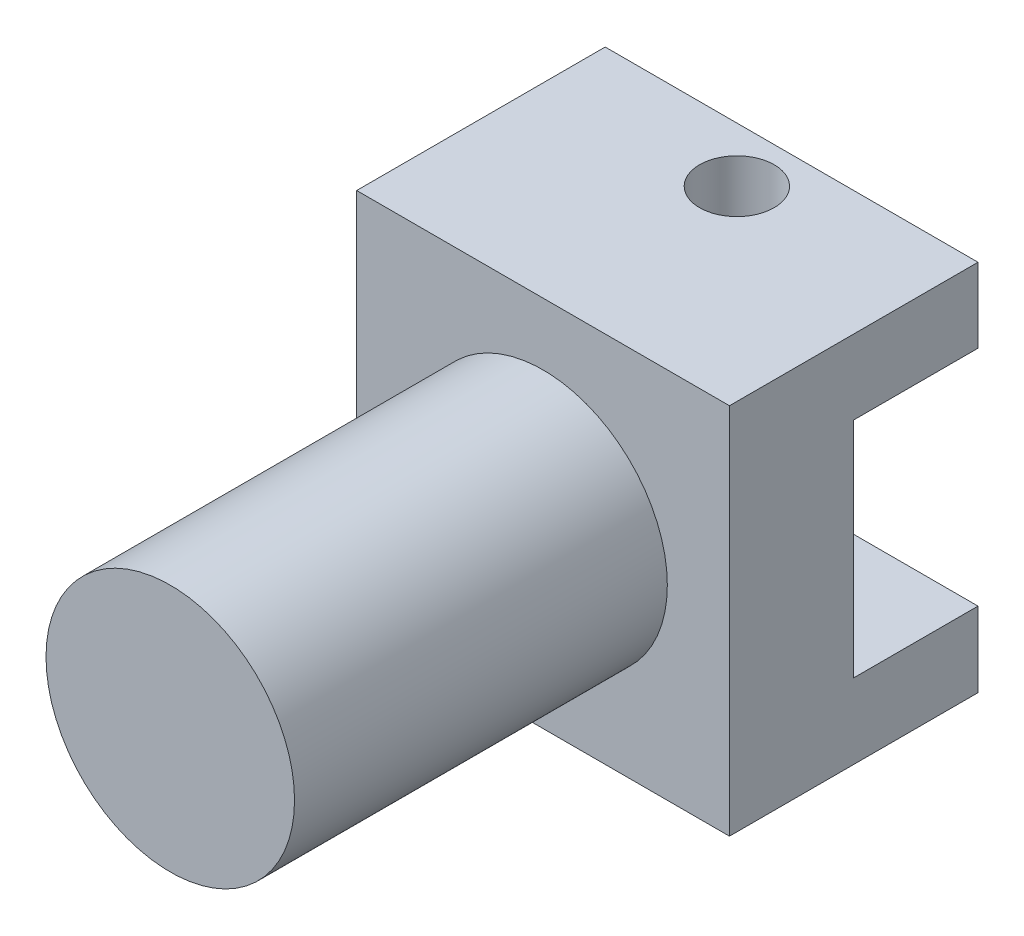
ISO-10303-21;
HEADER;
FILE_DESCRIPTION(('STEP AP214'),'2;1');
FILE_NAME('part.step','',(''),(''),'','','');
FILE_SCHEMA(('AUTOMOTIVE_DESIGN { 1 0 10303 214 1 1 1 1 }'));
ENDSEC;
DATA;
#1=APPLICATION_CONTEXT('core data for automotive mechanical design processes');
#2=APPLICATION_PROTOCOL_DEFINITION('international standard','automotive_design',2000,#1);
#3=PRODUCT_CONTEXT('',#1,'mechanical');
#4=PRODUCT('Part','Part','',(#3));
#5=PRODUCT_RELATED_PRODUCT_CATEGORY('part','',(#4));
#6=PRODUCT_DEFINITION_FORMATION('','',#4);
#7=PRODUCT_DEFINITION_CONTEXT('part definition',#1,'design');
#8=PRODUCT_DEFINITION('design','',#6,#7);
#9=PRODUCT_DEFINITION_SHAPE('','',#8);
#10=(LENGTH_UNIT() NAMED_UNIT(*) SI_UNIT(.MILLI.,.METRE.));
#11=(NAMED_UNIT(*) PLANE_ANGLE_UNIT() SI_UNIT($,.RADIAN.));
#12=(NAMED_UNIT(*) SI_UNIT($,.STERADIAN.) SOLID_ANGLE_UNIT());
#13=UNCERTAINTY_MEASURE_WITH_UNIT(LENGTH_MEASURE(1.E-05),#10,'distance_accuracy_value','');
#14=(GEOMETRIC_REPRESENTATION_CONTEXT(3) GLOBAL_UNCERTAINTY_ASSIGNED_CONTEXT((#13)) GLOBAL_UNIT_ASSIGNED_CONTEXT((#10,
#11,#12)) REPRESENTATION_CONTEXT('',''));
#15=CARTESIAN_POINT('',(0.,0.,0.));
#16=DIRECTION('',(0.,0.,1.));
#17=DIRECTION('',(1.,0.,0.));
#18=AXIS2_PLACEMENT_3D('',#15,#16,#17);
#19=CARTESIAN_POINT('',(0.,0.,25.4));
#20=DIRECTION('',(1.,0.,0.));
#21=DIRECTION('',(0.,0.,-1.));
#22=AXIS2_PLACEMENT_3D('',#19,#20,#21);
#23=PLANE('',#22);
#24=DIRECTION('',(0.,0.,-1.));
#25=VECTOR('',#24,1.);
#26=CARTESIAN_POINT('',(0.,76.2,25.4));
#27=LINE('',#26,#25);
#28=CARTESIAN_POINT('',(0.,76.2,25.4));
#29=VERTEX_POINT('',#28);
#30=CARTESIAN_POINT('',(0.,76.2,-25.4));
#31=VERTEX_POINT('',#30);
#32=EDGE_CURVE('E172',#29,#31,#27,.T.);
#33=ORIENTED_EDGE('',*,*,#32,.T.);
#34=DIRECTION('',(0.,1.,0.));
#35=VECTOR('',#34,1.);
#36=CARTESIAN_POINT('',(0.,0.,-25.4));
#37=LINE('',#36,#35);
#38=CARTESIAN_POINT('',(0.,60.9780288814558,-25.4));
#39=VERTEX_POINT('',#38);
#40=EDGE_CURVE('E147',#39,#31,#37,.T.);
#41=ORIENTED_EDGE('',*,*,#40,.F.);
#42=DIRECTION('',(0.,0.,1.));
#43=VECTOR('',#42,1.);
#44=CARTESIAN_POINT('',(0.,60.9780288814558,-25.4));
#45=LINE('',#44,#43);
#46=CARTESIAN_POINT('',(0.,60.9780288814558,0.));
#47=VERTEX_POINT('',#46);
#48=EDGE_CURVE('E153',#39,#47,#45,.T.);
#49=ORIENTED_EDGE('',*,*,#48,.T.);
#50=DIRECTION('',(0.,-1.,0.));
#51=VECTOR('',#50,1.);
#52=CARTESIAN_POINT('',(0.,0.,0.));
#53=LINE('',#52,#51);
#54=CARTESIAN_POINT('',(0.,15.3324929971992,0.));
#55=VERTEX_POINT('',#54);
#56=EDGE_CURVE('E163',#47,#55,#53,.T.);
#57=ORIENTED_EDGE('',*,*,#56,.T.);
#58=DIRECTION('',(0.,0.,1.));
#59=VECTOR('',#58,1.);
#60=CARTESIAN_POINT('',(0.,15.3324929971992,-25.4));
#61=LINE('',#60,#59);
#62=CARTESIAN_POINT('',(0.,15.3324929971992,-25.4));
#63=VERTEX_POINT('',#62);
#64=EDGE_CURVE('E116',#63,#55,#61,.T.);
#65=ORIENTED_EDGE('',*,*,#64,.F.);
#66=DIRECTION('',(0.,1.,0.));
#67=VECTOR('',#66,1.);
#68=CARTESIAN_POINT('',(0.,0.,-25.4));
#69=LINE('',#68,#67);
#70=CARTESIAN_POINT('',(0.,0.,-25.4));
#71=VERTEX_POINT('',#70);
#72=EDGE_CURVE('E131',#71,#63,#69,.T.);
#73=ORIENTED_EDGE('',*,*,#72,.F.);
#74=DIRECTION('',(0.,0.,-1.));
#75=VECTOR('',#74,1.);
#76=CARTESIAN_POINT('',(0.,0.,25.4));
#77=LINE('',#76,#75);
#78=CARTESIAN_POINT('',(0.,0.,25.4));
#79=VERTEX_POINT('',#78);
#80=EDGE_CURVE('E48',#79,#71,#77,.T.);
#81=ORIENTED_EDGE('',*,*,#80,.F.);
#82=DIRECTION('',(0.,-1.,0.));
#83=VECTOR('',#82,1.);
#84=CARTESIAN_POINT('',(0.,0.,25.4));
#85=LINE('',#84,#83);
#86=EDGE_CURVE('E165',#29,#79,#85,.T.);
#87=ORIENTED_EDGE('',*,*,#86,.F.);
#88=EDGE_LOOP('',(#33,#41,#49,#57,#65,#73,#81,#87));
#89=FACE_BOUND('',#88,.T.);
#90=ADVANCED_FACE('F40',(#89),#23,.F.);
#91=CARTESIAN_POINT('',(0.,0.,25.4));
#92=DIRECTION('',(0.,1.,0.));
#93=DIRECTION('',(0.,0.,1.));
#94=AXIS2_PLACEMENT_3D('',#91,#92,#93);
#95=PLANE('',#94);
#96=CARTESIAN_POINT('',(38.1,0.,-14.213689229737));
#97=DIRECTION('',(0.,-1.,0.));
#98=DIRECTION('',(0.,0.,-1.));
#99=AXIS2_PLACEMENT_3D('',#96,#97,#98);
#100=CIRCLE('',#99,7.62);
#101=CARTESIAN_POINT('',(38.1,0.,-21.833689229737));
#102=VERTEX_POINT('',#101);
#103=EDGE_CURVE('E225',#102,#102,#100,.T.);
#104=ORIENTED_EDGE('',*,*,#103,.F.);
#105=EDGE_LOOP('',(#104));
#106=FACE_BOUND('',#105,.T.);
#107=ORIENTED_EDGE('',*,*,#80,.T.);
#108=DIRECTION('',(-1.,0.,0.));
#109=VECTOR('',#108,1.);
#110=CARTESIAN_POINT('',(0.,0.,-25.4));
#111=LINE('',#110,#109);
#112=CARTESIAN_POINT('',(76.2,0.,-25.4));
#113=VERTEX_POINT('',#112);
#114=EDGE_CURVE('E127',#113,#71,#111,.T.);
#115=ORIENTED_EDGE('',*,*,#114,.F.);
#116=DIRECTION('',(0.,0.,-1.));
#117=VECTOR('',#116,1.);
#118=CARTESIAN_POINT('',(76.2,0.,25.4));
#119=LINE('',#118,#117);
#120=CARTESIAN_POINT('',(76.2,0.,25.4));
#121=VERTEX_POINT('',#120);
#122=EDGE_CURVE('E123',#121,#113,#119,.T.);
#123=ORIENTED_EDGE('',*,*,#122,.F.);
#124=DIRECTION('',(1.,0.,0.));
#125=VECTOR('',#124,1.);
#126=CARTESIAN_POINT('',(0.,0.,25.4));
#127=LINE('',#126,#125);
#128=EDGE_CURVE('E167',#79,#121,#127,.T.);
#129=ORIENTED_EDGE('',*,*,#128,.F.);
#130=EDGE_LOOP('',(#107,#115,#123,#129));
#131=FACE_BOUND('',#130,.T.);
#132=ADVANCED_FACE('F181',(#106,#131),#95,.F.);
#133=CARTESIAN_POINT('',(76.2,0.,25.4));
#134=DIRECTION('',(-1.,0.,0.));
#135=DIRECTION('',(0.,0.,1.));
#136=AXIS2_PLACEMENT_3D('',#133,#134,#135);
#137=PLANE('',#136);
#138=ORIENTED_EDGE('',*,*,#122,.T.);
#139=DIRECTION('',(0.,-1.,0.));
#140=VECTOR('',#139,1.);
#141=CARTESIAN_POINT('',(76.2,0.,-25.4));
#142=LINE('',#141,#140);
#143=CARTESIAN_POINT('',(76.2,15.3324929971992,-25.4));
#144=VERTEX_POINT('',#143);
#145=EDGE_CURVE('E119',#144,#113,#142,.T.);
#146=ORIENTED_EDGE('',*,*,#145,.F.);
#147=DIRECTION('',(0.,0.,1.));
#148=VECTOR('',#147,1.);
#149=CARTESIAN_POINT('',(76.2,15.3324929971992,-25.4));
#150=LINE('',#149,#148);
#151=CARTESIAN_POINT('',(76.2,15.3324929971992,0.));
#152=VERTEX_POINT('',#151);
#153=EDGE_CURVE('E108',#144,#152,#150,.T.);
#154=ORIENTED_EDGE('',*,*,#153,.T.);
#155=DIRECTION('',(0.,1.,0.));
#156=VECTOR('',#155,1.);
#157=CARTESIAN_POINT('',(76.2,0.,0.));
#158=LINE('',#157,#156);
#159=CARTESIAN_POINT('',(76.2,60.9780288814558,0.));
#160=VERTEX_POINT('',#159);
#161=EDGE_CURVE('E56',#152,#160,#158,.T.);
#162=ORIENTED_EDGE('',*,*,#161,.T.);
#163=DIRECTION('',(0.,0.,1.));
#164=VECTOR('',#163,1.);
#165=CARTESIAN_POINT('',(76.2,60.9780288814558,-25.4));
#166=LINE('',#165,#164);
#167=CARTESIAN_POINT('',(76.2,60.9780288814558,-25.4));
#168=VERTEX_POINT('',#167);
#169=EDGE_CURVE('E158',#168,#160,#166,.T.);
#170=ORIENTED_EDGE('',*,*,#169,.F.);
#171=DIRECTION('',(0.,-1.,0.));
#172=VECTOR('',#171,1.);
#173=CARTESIAN_POINT('',(76.2,0.,-25.4));
#174=LINE('',#173,#172);
#175=CARTESIAN_POINT('',(76.2,76.2,-25.4));
#176=VERTEX_POINT('',#175);
#177=EDGE_CURVE('E142',#176,#168,#174,.T.);
#178=ORIENTED_EDGE('',*,*,#177,.F.);
#179=DIRECTION('',(0.,0.,-1.));
#180=VECTOR('',#179,1.);
#181=CARTESIAN_POINT('',(76.2,76.2,25.4));
#182=LINE('',#181,#180);
#183=CARTESIAN_POINT('',(76.2,76.2,25.4));
#184=VERTEX_POINT('',#183);
#185=EDGE_CURVE('E177',#184,#176,#182,.T.);
#186=ORIENTED_EDGE('',*,*,#185,.F.);
#187=DIRECTION('',(0.,1.,0.));
#188=VECTOR('',#187,1.);
#189=CARTESIAN_POINT('',(76.2,0.,25.4));
#190=LINE('',#189,#188);
#191=EDGE_CURVE('E169',#121,#184,#190,.T.);
#192=ORIENTED_EDGE('',*,*,#191,.F.);
#193=EDGE_LOOP('',(#138,#146,#154,#162,#170,#178,#186,#192));
#194=FACE_BOUND('',#193,.T.);
#195=ADVANCED_FACE('F120',(#194),#137,.F.);
#196=CARTESIAN_POINT('',(0.,76.2,25.4));
#197=DIRECTION('',(0.,-1.,0.));
#198=DIRECTION('',(0.,0.,-1.));
#199=AXIS2_PLACEMENT_3D('',#196,#197,#198);
#200=PLANE('',#199);
#201=CARTESIAN_POINT('',(38.1,76.2,-14.213689229737));
#202=DIRECTION('',(0.,-1.,0.));
#203=DIRECTION('',(0.,0.,-1.));
#204=AXIS2_PLACEMENT_3D('',#201,#202,#203);
#205=CIRCLE('',#204,7.62);
#206=CARTESIAN_POINT('',(38.1,76.2,-21.833689229737));
#207=VERTEX_POINT('',#206);
#208=EDGE_CURVE('E227',#207,#207,#205,.T.);
#209=ORIENTED_EDGE('',*,*,#208,.T.);
#210=EDGE_LOOP('',(#209));
#211=FACE_BOUND('',#210,.T.);
#212=ORIENTED_EDGE('',*,*,#185,.T.);
#213=DIRECTION('',(1.,0.,0.));
#214=VECTOR('',#213,1.);
#215=CARTESIAN_POINT('',(0.,76.2,-25.4));
#216=LINE('',#215,#214);
#217=EDGE_CURVE('E150',#31,#176,#216,.T.);
#218=ORIENTED_EDGE('',*,*,#217,.F.);
#219=ORIENTED_EDGE('',*,*,#32,.F.);
#220=DIRECTION('',(-1.,0.,0.));
#221=VECTOR('',#220,1.);
#222=CARTESIAN_POINT('',(0.,76.2,25.4));
#223=LINE('',#222,#221);
#224=EDGE_CURVE('E64',#184,#29,#223,.T.);
#225=ORIENTED_EDGE('',*,*,#224,.F.);
#226=EDGE_LOOP('',(#212,#218,#219,#225));
#227=FACE_BOUND('',#226,.T.);
#228=ADVANCED_FACE('F196',(#211,#227),#200,.F.);
#229=CARTESIAN_POINT('',(0.,0.,25.4));
#230=DIRECTION('',(0.,0.,-1.));
#231=DIRECTION('',(-1.,0.,0.));
#232=AXIS2_PLACEMENT_3D('',#229,#230,#231);
#233=PLANE('',#232);
#234=CARTESIAN_POINT('',(38.1,38.1,25.4));
#235=DIRECTION('',(0.,0.,1.));
#236=DIRECTION('',(1.,0.,0.));
#237=AXIS2_PLACEMENT_3D('',#234,#235,#236);
#238=CIRCLE('',#237,25.4);
#239=CARTESIAN_POINT('',(12.7,38.1,25.4));
#240=VERTEX_POINT('',#239);
#241=EDGE_CURVE('E11',#240,#240,#238,.T.);
#242=ORIENTED_EDGE('',*,*,#241,.F.);
#243=EDGE_LOOP('',(#242));
#244=FACE_BOUND('',#243,.T.);
#245=ORIENTED_EDGE('',*,*,#86,.T.);
#246=ORIENTED_EDGE('',*,*,#128,.T.);
#247=ORIENTED_EDGE('',*,*,#191,.T.);
#248=ORIENTED_EDGE('',*,*,#224,.T.);
#249=EDGE_LOOP('',(#245,#246,#247,#248));
#250=FACE_BOUND('',#249,.T.);
#251=ADVANCED_FACE('F197',(#244,#250),#233,.F.);
#252=CARTESIAN_POINT('',(0.,0.,0.));
#253=DIRECTION('',(0.,0.,-1.));
#254=DIRECTION('',(-1.,0.,0.));
#255=AXIS2_PLACEMENT_3D('',#252,#253,#254);
#256=PLANE('',#255);
#257=DIRECTION('',(-1.,0.,0.));
#258=VECTOR('',#257,1.);
#259=CARTESIAN_POINT('',(0.,15.3324929971992,0.));
#260=LINE('',#259,#258);
#261=EDGE_CURVE('E114',#152,#55,#260,.T.);
#262=ORIENTED_EDGE('',*,*,#261,.T.);
#263=ORIENTED_EDGE('',*,*,#56,.F.);
#264=DIRECTION('',(-1.,0.,0.));
#265=VECTOR('',#264,1.);
#266=CARTESIAN_POINT('',(0.,60.9780288814558,0.));
#267=LINE('',#266,#265);
#268=EDGE_CURVE('E115',#160,#47,#267,.T.);
#269=ORIENTED_EDGE('',*,*,#268,.F.);
#270=ORIENTED_EDGE('',*,*,#161,.F.);
#271=EDGE_LOOP('',(#262,#263,#269,#270));
#272=FACE_BOUND('',#271,.T.);
#273=ADVANCED_FACE('F185',(#272),#256,.T.);
#274=CARTESIAN_POINT('',(38.1,38.1,101.6));
#275=DIRECTION('',(0.,0.,-1.));
#276=DIRECTION('',(-1.,0.,0.));
#277=AXIS2_PLACEMENT_3D('',#274,#275,#276);
#278=CYLINDRICAL_SURFACE('',#277,25.4);
#279=CARTESIAN_POINT('',(38.1,38.1,101.6));
#280=DIRECTION('',(0.,0.,1.));
#281=DIRECTION('',(1.,0.,0.));
#282=AXIS2_PLACEMENT_3D('',#279,#280,#281);
#283=CIRCLE('',#282,25.4);
#284=CARTESIAN_POINT('',(12.7,38.1,101.6));
#285=VERTEX_POINT('',#284);
#286=EDGE_CURVE('E161',#285,#285,#283,.T.);
#287=CARTESIAN_POINT('',(12.7,38.1,101.6));
#288=CARTESIAN_POINT('',(12.7,38.1,100.80625));
#289=CARTESIAN_POINT('',(12.7,38.1,100.0125));
#290=CARTESIAN_POINT('',(12.7,38.1,98.425));
#291=CARTESIAN_POINT('',(12.7,38.1,97.63125));
#292=CARTESIAN_POINT('',(12.7,38.1,96.04375));
#293=CARTESIAN_POINT('',(12.7,38.1,95.25));
#294=CARTESIAN_POINT('',(12.7,38.1,93.6625));
#295=CARTESIAN_POINT('',(12.7,38.1,92.86875));
#296=CARTESIAN_POINT('',(12.7,38.1,91.28125));
#297=CARTESIAN_POINT('',(12.7,38.1,90.4875));
#298=CARTESIAN_POINT('',(12.7,38.1,88.9));
#299=CARTESIAN_POINT('',(12.7,38.1,88.10625));
#300=CARTESIAN_POINT('',(12.7,38.1,86.51875));
#301=CARTESIAN_POINT('',(12.7,38.1,85.725));
#302=CARTESIAN_POINT('',(12.7,38.1,84.1375));
#303=CARTESIAN_POINT('',(12.7,38.1,83.34375));
#304=CARTESIAN_POINT('',(12.7,38.1,81.75625));
#305=CARTESIAN_POINT('',(12.7,38.1,80.9625));
#306=CARTESIAN_POINT('',(12.7,38.1,79.375));
#307=CARTESIAN_POINT('',(12.7,38.1,78.58125));
#308=CARTESIAN_POINT('',(12.7,38.1,76.99375));
#309=CARTESIAN_POINT('',(12.7,38.1,76.2));
#310=CARTESIAN_POINT('',(12.7,38.1,74.6125));
#311=CARTESIAN_POINT('',(12.7,38.1,73.81875));
#312=CARTESIAN_POINT('',(12.7,38.1,72.23125));
#313=CARTESIAN_POINT('',(12.7,38.1,71.4375));
#314=CARTESIAN_POINT('',(12.7,38.1,69.85));
#315=CARTESIAN_POINT('',(12.7,38.1,69.05625));
#316=CARTESIAN_POINT('',(12.7,38.1,67.46875));
#317=CARTESIAN_POINT('',(12.7,38.1,66.675));
#318=CARTESIAN_POINT('',(12.7,38.1,65.0875));
#319=CARTESIAN_POINT('',(12.7,38.1,64.29375));
#320=CARTESIAN_POINT('',(12.7,38.1,62.70625));
#321=CARTESIAN_POINT('',(12.7,38.1,61.9125));
#322=CARTESIAN_POINT('',(12.7,38.1,60.325));
#323=CARTESIAN_POINT('',(12.7,38.1,59.53125));
#324=CARTESIAN_POINT('',(12.7,38.1,57.94375));
#325=CARTESIAN_POINT('',(12.7,38.1,57.15));
#326=CARTESIAN_POINT('',(12.7,38.1,55.5625));
#327=CARTESIAN_POINT('',(12.7,38.1,54.76875));
#328=CARTESIAN_POINT('',(12.7,38.1,53.18125));
#329=CARTESIAN_POINT('',(12.7,38.1,52.3875));
#330=CARTESIAN_POINT('',(12.7,38.1,50.8));
#331=CARTESIAN_POINT('',(12.7,38.1,50.00625));
#332=CARTESIAN_POINT('',(12.7,38.1,48.41875));
#333=CARTESIAN_POINT('',(12.7,38.1,47.625));
#334=CARTESIAN_POINT('',(12.7,38.1,46.0375));
#335=CARTESIAN_POINT('',(12.7,38.1,45.24375));
#336=CARTESIAN_POINT('',(12.7,38.1,43.65625));
#337=CARTESIAN_POINT('',(12.7,38.1,42.8625));
#338=CARTESIAN_POINT('',(12.7,38.1,41.275));
#339=CARTESIAN_POINT('',(12.7,38.1,40.48125));
#340=CARTESIAN_POINT('',(12.7,38.1,38.89375));
#341=CARTESIAN_POINT('',(12.7,38.1,38.1));
#342=CARTESIAN_POINT('',(12.7,38.1,36.5125));
#343=CARTESIAN_POINT('',(12.7,38.1,35.71875));
#344=CARTESIAN_POINT('',(12.7,38.1,34.13125));
#345=CARTESIAN_POINT('',(12.7,38.1,33.3375));
#346=CARTESIAN_POINT('',(12.7,38.1,31.75));
#347=CARTESIAN_POINT('',(12.7,38.1,30.95625));
#348=CARTESIAN_POINT('',(12.7,38.1,29.36875));
#349=CARTESIAN_POINT('',(12.7,38.1,28.575));
#350=CARTESIAN_POINT('',(12.7,38.1,26.9875));
#351=CARTESIAN_POINT('',(12.7,38.1,26.19375));
#352=CARTESIAN_POINT('',(12.7,38.1,25.4));
#353=B_SPLINE_CURVE_WITH_KNOTS('',3,(#287,#288,#289,#290,#291,#292,#293,#294,#295,#296,#297,
#298,#299,#300,#301,#302,#303,#304,#305,#306,#307,#308,#309,#310,#311,#312,#313,#314,#315,#316,
#317,#318,#319,#320,#321,#322,#323,#324,#325,#326,#327,#328,#329,#330,#331,#332,#333,#334,#335,
#336,#337,#338,#339,#340,#341,#342,#343,#344,#345,#346,#347,#348,#349,#350,#351,#352),
.UNSPECIFIED.,.F.,.F.,(4,2,2,2,2,2,2,2,2,2,2,2,2,2,2,2,2,2,2,2,2,2,2,2,2,2,2,2,2,2,2,2,4),(0.,
2.38125,4.7625,7.14375,9.52500000000001,11.90625,14.2875,16.66875,19.05,21.43125,23.8125,
26.19375,28.575,30.95625,33.3375,35.71875,38.1,40.48125,42.8625,45.24375,47.625,50.00625,
52.3875,54.76875,57.15,59.53125,61.9125,64.29375,66.675,69.05625,71.4375,73.81875,76.2),.UNSPECIFIED.);
#354=EDGE_CURVE('BSEAM205',#285,#240,#353,.T.);
#355=ORIENTED_EDGE('',*,*,#286,.F.);
#356=ORIENTED_EDGE('',*,*,#241,.T.);
#357=ORIENTED_EDGE('',*,*,#354,.T.);
#358=ORIENTED_EDGE('',*,*,#354,.F.);
#359=EDGE_LOOP('',(#355,#357,#356,#358));
#360=FACE_BOUND('',#359,.T.);
#361=ADVANCED_FACE('F205',(#360),#278,.T.);
#362=CARTESIAN_POINT('',(0.,0.,101.6));
#363=DIRECTION('',(0.,0.,1.));
#364=DIRECTION('',(1.,0.,0.));
#365=AXIS2_PLACEMENT_3D('',#362,#363,#364);
#366=PLANE('',#365);
#367=ORIENTED_EDGE('',*,*,#286,.T.);
#368=EDGE_LOOP('',(#367));
#369=FACE_BOUND('',#368,.T.);
#370=ADVANCED_FACE('F256',(#369),#366,.T.);
#371=CARTESIAN_POINT('',(0.,60.9780288814558,-25.4));
#372=DIRECTION('',(0.,1.,0.));
#373=DIRECTION('',(0.,0.,1.));
#374=AXIS2_PLACEMENT_3D('',#371,#372,#373);
#375=PLANE('',#374);
#376=CARTESIAN_POINT('',(38.1,60.9780288814558,-14.213689229737));
#377=DIRECTION('',(0.,1.,0.));
#378=DIRECTION('',(0.,0.,1.));
#379=AXIS2_PLACEMENT_3D('',#376,#377,#378);
#380=CIRCLE('',#379,7.62);
#381=CARTESIAN_POINT('',(38.1,60.9780288814558,-21.833689229737));
#382=VERTEX_POINT('',#381);
#383=EDGE_CURVE('E134',#382,#382,#380,.T.);
#384=ORIENTED_EDGE('',*,*,#383,.T.);
#385=EDGE_LOOP('',(#384));
#386=FACE_BOUND('',#385,.T.);
#387=ORIENTED_EDGE('',*,*,#268,.T.);
#388=ORIENTED_EDGE('',*,*,#48,.F.);
#389=DIRECTION('',(-1.,0.,0.));
#390=VECTOR('',#389,1.);
#391=CARTESIAN_POINT('',(0.,60.9780288814558,-25.4));
#392=LINE('',#391,#390);
#393=EDGE_CURVE('E145',#168,#39,#392,.T.);
#394=ORIENTED_EDGE('',*,*,#393,.F.);
#395=ORIENTED_EDGE('',*,*,#169,.T.);
#396=EDGE_LOOP('',(#387,#388,#394,#395));
#397=FACE_BOUND('',#396,.T.);
#398=ADVANCED_FACE('F188',(#386,#397),#375,.F.);
#399=CARTESIAN_POINT('',(0.,0.,-25.4));
#400=DIRECTION('',(0.,0.,-1.));
#401=DIRECTION('',(-1.,0.,0.));
#402=AXIS2_PLACEMENT_3D('',#399,#400,#401);
#403=PLANE('',#402);
#404=ORIENTED_EDGE('',*,*,#177,.T.);
#405=ORIENTED_EDGE('',*,*,#393,.T.);
#406=ORIENTED_EDGE('',*,*,#40,.T.);
#407=ORIENTED_EDGE('',*,*,#217,.T.);
#408=EDGE_LOOP('',(#404,#405,#406,#407));
#409=FACE_BOUND('',#408,.T.);
#410=ADVANCED_FACE('F192',(#409),#403,.T.);
#411=CARTESIAN_POINT('',(0.,15.3324929971992,-25.4));
#412=DIRECTION('',(0.,1.,0.));
#413=DIRECTION('',(0.,0.,1.));
#414=AXIS2_PLACEMENT_3D('',#411,#412,#413);
#415=PLANE('',#414);
#416=CARTESIAN_POINT('',(38.1,15.3324929971992,-14.213689229737));
#417=DIRECTION('',(0.,1.,0.));
#418=DIRECTION('',(0.,0.,1.));
#419=AXIS2_PLACEMENT_3D('',#416,#417,#418);
#420=CIRCLE('',#419,7.62);
#421=CARTESIAN_POINT('',(38.1,15.3324929971992,-21.833689229737));
#422=VERTEX_POINT('',#421);
#423=EDGE_CURVE('E43',#422,#422,#420,.T.);
#424=ORIENTED_EDGE('',*,*,#423,.F.);
#425=EDGE_LOOP('',(#424));
#426=FACE_BOUND('',#425,.T.);
#427=ORIENTED_EDGE('',*,*,#261,.F.);
#428=ORIENTED_EDGE('',*,*,#153,.F.);
#429=DIRECTION('',(-1.,0.,0.));
#430=VECTOR('',#429,1.);
#431=CARTESIAN_POINT('',(0.,15.3324929971992,-25.4));
#432=LINE('',#431,#430);
#433=EDGE_CURVE('E112',#144,#63,#432,.T.);
#434=ORIENTED_EDGE('',*,*,#433,.T.);
#435=ORIENTED_EDGE('',*,*,#64,.T.);
#436=EDGE_LOOP('',(#427,#428,#434,#435));
#437=FACE_BOUND('',#436,.T.);
#438=ADVANCED_FACE('F110',(#426,#437),#415,.T.);
#439=CARTESIAN_POINT('',(0.,0.,-25.4));
#440=DIRECTION('',(0.,0.,-1.));
#441=DIRECTION('',(-1.,0.,0.));
#442=AXIS2_PLACEMENT_3D('',#439,#440,#441);
#443=PLANE('',#442);
#444=ORIENTED_EDGE('',*,*,#433,.F.);
#445=ORIENTED_EDGE('',*,*,#145,.T.);
#446=ORIENTED_EDGE('',*,*,#114,.T.);
#447=ORIENTED_EDGE('',*,*,#72,.T.);
#448=EDGE_LOOP('',(#444,#445,#446,#447));
#449=FACE_BOUND('',#448,.T.);
#450=ADVANCED_FACE('F129',(#449),#443,.T.);
#451=CARTESIAN_POINT('',(38.1,76.2,-14.213689229737));
#452=DIRECTION('',(0.,-1.,0.));
#453=DIRECTION('',(0.,0.,-1.));
#454=AXIS2_PLACEMENT_3D('',#451,#452,#453);
#455=CYLINDRICAL_SURFACE('',#454,7.62);
#456=CARTESIAN_POINT('',(38.1,15.3324929971992,-21.833689229737));
#457=CARTESIAN_POINT('',(38.1,15.1727795284784,-21.833689229737));
#458=CARTESIAN_POINT('',(38.1,15.0130660597575,-21.833689229737));
#459=CARTESIAN_POINT('',(38.1,14.6936391223159,-21.833689229737));
#460=CARTESIAN_POINT('',(38.1,14.5339256535951,-21.833689229737));
#461=CARTESIAN_POINT('',(38.1,14.2144987161534,-21.833689229737));
#462=CARTESIAN_POINT('',(38.1,14.0547852474326,-21.833689229737));
#463=CARTESIAN_POINT('',(38.1,13.7353583099909,-21.833689229737));
#464=CARTESIAN_POINT('',(38.1,13.5756448412701,-21.833689229737));
#465=CARTESIAN_POINT('',(38.1,13.2562179038285,-21.833689229737));
#466=CARTESIAN_POINT('',(38.1,13.0965044351076,-21.833689229737));
#467=CARTESIAN_POINT('',(38.1,12.777077497666,-21.833689229737));
#468=CARTESIAN_POINT('',(38.1,12.6173640289452,-21.833689229737));
#469=CARTESIAN_POINT('',(38.1,12.2979370915035,-21.833689229737));
#470=CARTESIAN_POINT('',(38.1,12.1382236227827,-21.833689229737));
#471=CARTESIAN_POINT('',(38.1,11.818796685341,-21.833689229737));
#472=CARTESIAN_POINT('',(38.1,11.6590832166202,-21.833689229737));
#473=CARTESIAN_POINT('',(38.1,11.3396562791786,-21.833689229737));
#474=CARTESIAN_POINT('',(38.1,11.1799428104577,-21.833689229737));
#475=CARTESIAN_POINT('',(38.1,10.8605158730161,-21.833689229737));
#476=CARTESIAN_POINT('',(38.1,10.7008024042953,-21.833689229737));
#477=CARTESIAN_POINT('',(38.1,10.3813754668536,-21.833689229737));
#478=CARTESIAN_POINT('',(38.1,10.2216619981328,-21.833689229737));
#479=CARTESIAN_POINT('',(38.1,9.90223506069115,-21.833689229737));
#480=CARTESIAN_POINT('',(38.1,9.74252159197032,-21.833689229737));
#481=CARTESIAN_POINT('',(38.1,9.42309465452866,-21.833689229737));
#482=CARTESIAN_POINT('',(38.1,9.26338118580784,-21.833689229737));
#483=CARTESIAN_POINT('',(38.1,8.94395424836619,-21.833689229737));
#484=CARTESIAN_POINT('',(38.1,8.78424077964537,-21.833689229737));
#485=CARTESIAN_POINT('',(38.1,8.46481384220372,-21.833689229737));
#486=CARTESIAN_POINT('',(38.1,8.3051003734829,-21.833689229737));
#487=CARTESIAN_POINT('',(38.1,7.98567343604125,-21.833689229737));
#488=CARTESIAN_POINT('',(38.1,7.82595996732042,-21.833689229737));
#489=CARTESIAN_POINT('',(38.1,7.50653302987877,-21.833689229737));
#490=CARTESIAN_POINT('',(38.1,7.34681956115794,-21.833689229737));
#491=CARTESIAN_POINT('',(38.1,7.02739262371629,-21.833689229737));
#492=CARTESIAN_POINT('',(38.1,6.86767915499547,-21.833689229737));
#493=CARTESIAN_POINT('',(38.1,6.54825221755382,-21.833689229737));
#494=CARTESIAN_POINT('',(38.1,6.388538748833,-21.833689229737));
#495=CARTESIAN_POINT('',(38.1,6.06911181139135,-21.833689229737));
#496=CARTESIAN_POINT('',(38.1,5.90939834267052,-21.833689229737));
#497=CARTESIAN_POINT('',(38.1,5.58997140522887,-21.833689229737));
#498=CARTESIAN_POINT('',(38.1,5.43025793650804,-21.833689229737));
#499=CARTESIAN_POINT('',(38.1,5.11083099906639,-21.833689229737));
#500=CARTESIAN_POINT('',(38.1,4.95111753034557,-21.833689229737));
#501=CARTESIAN_POINT('',(38.1,4.63169059290392,-21.833689229737));
#502=CARTESIAN_POINT('',(38.1,4.4719771241831,-21.833689229737));
#503=CARTESIAN_POINT('',(38.1,4.15255018674145,-21.833689229737));
#504=CARTESIAN_POINT('',(38.1,3.99283671802062,-21.833689229737));
#505=CARTESIAN_POINT('',(38.1,3.67340978057897,-21.833689229737));
#506=CARTESIAN_POINT('',(38.1,3.51369631185814,-21.833689229737));
#507=CARTESIAN_POINT('',(38.1,3.19426937441649,-21.833689229737));
#508=CARTESIAN_POINT('',(38.1,3.03455590569567,-21.833689229737));
#509=CARTESIAN_POINT('',(38.1,2.71512896825402,-21.833689229737));
#510=CARTESIAN_POINT('',(38.1,2.5554154995332,-21.833689229737));
#511=CARTESIAN_POINT('',(38.1,2.23598856209155,-21.833689229737));
#512=CARTESIAN_POINT('',(38.1,2.07627509337073,-21.833689229737));
#513=CARTESIAN_POINT('',(38.1,1.75684815592907,-21.833689229737));
#514=CARTESIAN_POINT('',(38.1,1.59713468720824,-21.833689229737));
#515=CARTESIAN_POINT('',(38.1,1.27770774976659,-21.833689229737));
#516=CARTESIAN_POINT('',(38.1,1.11799428104577,-21.833689229737));
#517=CARTESIAN_POINT('',(38.1,0.798567343604127,-21.833689229737));
#518=CARTESIAN_POINT('',(38.1,0.638853874883304,-21.833689229737));
#519=CARTESIAN_POINT('',(38.1,0.319426937441654,-21.833689229737));
#520=CARTESIAN_POINT('',(38.1,0.159713468720827,-21.833689229737));
#521=CARTESIAN_POINT('',(38.1,0.,-21.833689229737));
#522=B_SPLINE_CURVE_WITH_KNOTS('',3,(#456,#457,#458,#459,#460,#461,#462,#463,#464,#465,#466,
#467,#468,#469,#470,#471,#472,#473,#474,#475,#476,#477,#478,#479,#480,#481,#482,#483,#484,#485,
#486,#487,#488,#489,#490,#491,#492,#493,#494,#495,#496,#497,#498,#499,#500,#501,#502,#503,#504,
#505,#506,#507,#508,#509,#510,#511,#512,#513,#514,#515,#516,#517,#518,#519,#520,#521),
.UNSPECIFIED.,.F.,.F.,(4,2,2,2,2,2,2,2,2,2,2,2,2,2,2,2,2,2,2,2,2,2,2,2,2,2,2,2,2,2,2,2,4),(0.,
0.479140406162475,0.958280812324949,1.43742121848742,1.91656162464989,2.39570203081237,
2.87484243697484,3.35398284313731,3.83312324929979,4.31226365546227,4.79140406162474,
5.27054446778721,5.74968487394969,6.22882528011217,6.70796568627464,7.18710609243711,
7.66624649859959,8.14538690476207,8.62452731092454,9.103667717087,9.58280812324949,
10.061948529412,10.5410889355744,11.0202293417369,11.4993697478994,11.9785101540619,
12.4576505602243,12.9367909663868,13.4159313725493,13.8950717787118,14.3742121848742,
14.8533525910367,15.3324929971992),.UNSPECIFIED.);
#523=EDGE_CURVE('BSEAM240',#422,#102,#522,.T.);
#524=ORIENTED_EDGE('',*,*,#423,.T.);
#525=ORIENTED_EDGE('',*,*,#103,.T.);
#526=ORIENTED_EDGE('',*,*,#523,.T.);
#527=ORIENTED_EDGE('',*,*,#523,.F.);
#528=EDGE_LOOP('',(#524,#526,#525,#527));
#529=FACE_BOUND('',#528,.T.);
#530=ADVANCED_FACE('F240',(#529),#455,.F.);
#531=CARTESIAN_POINT('',(38.1,76.2,-21.833689229737));
#532=CARTESIAN_POINT('',(38.1,76.0414378008485,-21.833689229737));
#533=CARTESIAN_POINT('',(38.1,75.882875601697,-21.833689229737));
#534=CARTESIAN_POINT('',(38.1,75.565751203394,-21.833689229737));
#535=CARTESIAN_POINT('',(38.1,75.4071890042425,-21.833689229737));
#536=CARTESIAN_POINT('',(38.1,75.0900646059395,-21.833689229737));
#537=CARTESIAN_POINT('',(38.1,74.931502406788,-21.833689229737));
#538=CARTESIAN_POINT('',(38.1,74.614378008485,-21.833689229737));
#539=CARTESIAN_POINT('',(38.1,74.4558158093335,-21.833689229737));
#540=CARTESIAN_POINT('',(38.1,74.1386914110305,-21.833689229737));
#541=CARTESIAN_POINT('',(38.1,73.980129211879,-21.833689229737));
#542=CARTESIAN_POINT('',(38.1,73.663004813576,-21.833689229737));
#543=CARTESIAN_POINT('',(38.1,73.5044426144245,-21.833689229737));
#544=CARTESIAN_POINT('',(38.1,73.1873182161215,-21.833689229737));
#545=CARTESIAN_POINT('',(38.1,73.02875601697,-21.833689229737));
#546=CARTESIAN_POINT('',(38.1,72.711631618667,-21.833689229737));
#547=CARTESIAN_POINT('',(38.1,72.5530694195155,-21.833689229737));
#548=CARTESIAN_POINT('',(38.1,72.2359450212125,-21.833689229737));
#549=CARTESIAN_POINT('',(38.1,72.0773828220609,-21.833689229737));
#550=CARTESIAN_POINT('',(38.1,71.7602584237579,-21.833689229737));
#551=CARTESIAN_POINT('',(38.1,71.6016962246064,-21.833689229737));
#552=CARTESIAN_POINT('',(38.1,71.2845718263034,-21.833689229737));
#553=CARTESIAN_POINT('',(38.1,71.1260096271519,-21.833689229737));
#554=CARTESIAN_POINT('',(38.1,70.8088852288489,-21.833689229737));
#555=CARTESIAN_POINT('',(38.1,70.6503230296974,-21.833689229737));
#556=CARTESIAN_POINT('',(38.1,70.3331986313944,-21.833689229737));
#557=CARTESIAN_POINT('',(38.1,70.1746364322429,-21.833689229737));
#558=CARTESIAN_POINT('',(38.1,69.8575120339399,-21.833689229737));
#559=CARTESIAN_POINT('',(38.1,69.6989498347884,-21.833689229737));
#560=CARTESIAN_POINT('',(38.1,69.3818254364854,-21.833689229737));
#561=CARTESIAN_POINT('',(38.1,69.2232632373339,-21.833689229737));
#562=CARTESIAN_POINT('',(38.1,68.9061388390309,-21.833689229737));
#563=CARTESIAN_POINT('',(38.1,68.7475766398794,-21.833689229737));
#564=CARTESIAN_POINT('',(38.1,68.4304522415764,-21.833689229737));
#565=CARTESIAN_POINT('',(38.1,68.2718900424249,-21.833689229737));
#566=CARTESIAN_POINT('',(38.1,67.9547656441219,-21.833689229737));
#567=CARTESIAN_POINT('',(38.1,67.7962034449704,-21.833689229737));
#568=CARTESIAN_POINT('',(38.1,67.4790790466674,-21.833689229737));
#569=CARTESIAN_POINT('',(38.1,67.3205168475159,-21.833689229737));
#570=CARTESIAN_POINT('',(38.1,67.0033924492129,-21.833689229737));
#571=CARTESIAN_POINT('',(38.1,66.8448302500614,-21.833689229737));
#572=CARTESIAN_POINT('',(38.1,66.5277058517584,-21.833689229737));
#573=CARTESIAN_POINT('',(38.1,66.3691436526069,-21.833689229737));
#574=CARTESIAN_POINT('',(38.1,66.0520192543039,-21.833689229737));
#575=CARTESIAN_POINT('',(38.1,65.8934570551524,-21.833689229737));
#576=CARTESIAN_POINT('',(38.1,65.5763326568494,-21.833689229737));
#577=CARTESIAN_POINT('',(38.1,65.4177704576979,-21.833689229737));
#578=CARTESIAN_POINT('',(38.1,65.1006460593948,-21.833689229737));
#579=CARTESIAN_POINT('',(38.1,64.9420838602433,-21.833689229737));
#580=CARTESIAN_POINT('',(38.1,64.6249594619403,-21.833689229737));
#581=CARTESIAN_POINT('',(38.1,64.4663972627888,-21.833689229737));
#582=CARTESIAN_POINT('',(38.1,64.1492728644858,-21.833689229737));
#583=CARTESIAN_POINT('',(38.1,63.9907106653343,-21.833689229737));
#584=CARTESIAN_POINT('',(38.1,63.6735862670313,-21.833689229737));
#585=CARTESIAN_POINT('',(38.1,63.5150240678798,-21.833689229737));
#586=CARTESIAN_POINT('',(38.1,63.1978996695768,-21.833689229737));
#587=CARTESIAN_POINT('',(38.1,63.0393374704253,-21.833689229737));
#588=CARTESIAN_POINT('',(38.1,62.7222130721223,-21.833689229737));
#589=CARTESIAN_POINT('',(38.1,62.5636508729708,-21.833689229737));
#590=CARTESIAN_POINT('',(38.1,62.2465264746678,-21.833689229737));
#591=CARTESIAN_POINT('',(38.1,62.0879642755163,-21.833689229737));
#592=CARTESIAN_POINT('',(38.1,61.7708398772133,-21.833689229737));
#593=CARTESIAN_POINT('',(38.1,61.6122776780618,-21.833689229737));
#594=CARTESIAN_POINT('',(38.1,61.2951532797588,-21.833689229737));
#595=CARTESIAN_POINT('',(38.1,61.1365910806073,-21.833689229737));
#596=CARTESIAN_POINT('',(38.1,60.9780288814558,-21.833689229737));
#597=B_SPLINE_CURVE_WITH_KNOTS('',3,(#531,#532,#533,#534,#535,#536,#537,#538,#539,#540,#541,
#542,#543,#544,#545,#546,#547,#548,#549,#550,#551,#552,#553,#554,#555,#556,#557,#558,#559,#560,
#561,#562,#563,#564,#565,#566,#567,#568,#569,#570,#571,#572,#573,#574,#575,#576,#577,#578,#579,
#580,#581,#582,#583,#584,#585,#586,#587,#588,#589,#590,#591,#592,#593,#594,#595,#596),
.UNSPECIFIED.,.F.,.F.,(4,2,2,2,2,2,2,2,2,2,2,2,2,2,2,2,2,2,2,2,2,2,2,2,2,2,2,2,2,2,2,2,4),(0.,
0.475686597454505,0.951373194909011,1.42705979236352,1.90274638981802,2.37843298727253,
2.85411958472703,3.32980618218154,3.80549277963604,4.28117937709056,4.75686597454507,
5.23255257199957,5.70823916945408,6.18392576690858,6.65961236436309,7.1352989618176,
7.6109855592721,8.08667215672661,8.56235875418113,9.03804535163563,9.51373194909014,
9.98941854654464,10.4651051439991,10.9407917414537,11.4164783389082,11.8921649363627,
12.3678515338172,12.8435381312717,13.3192247287262,13.7949113261807,14.2705979236352,
14.7462845210897,15.2219711185442),.UNSPECIFIED.);
#598=EDGE_CURVE('BSEAM238',#207,#382,#597,.T.);
#599=ORIENTED_EDGE('',*,*,#208,.F.);
#600=ORIENTED_EDGE('',*,*,#383,.F.);
#601=ORIENTED_EDGE('',*,*,#598,.T.);
#602=ORIENTED_EDGE('',*,*,#598,.F.);
#603=EDGE_LOOP('',(#599,#601,#600,#602));
#604=FACE_BOUND('',#603,.T.);
#605=ADVANCED_FACE('F238',(#604),#455,.F.);
#606=CLOSED_SHELL('',(#90,#132,#195,#228,#251,#273,#361,#370,#398,#410,#438,#450,#530,#605));
#607=MANIFOLD_SOLID_BREP('B2',#606);
#608=ADVANCED_BREP_SHAPE_REPRESENTATION('',(#18,#607),#14);
#609=SHAPE_DEFINITION_REPRESENTATION(#9,#608);
ENDSEC;
END-ISO-10303-21;
